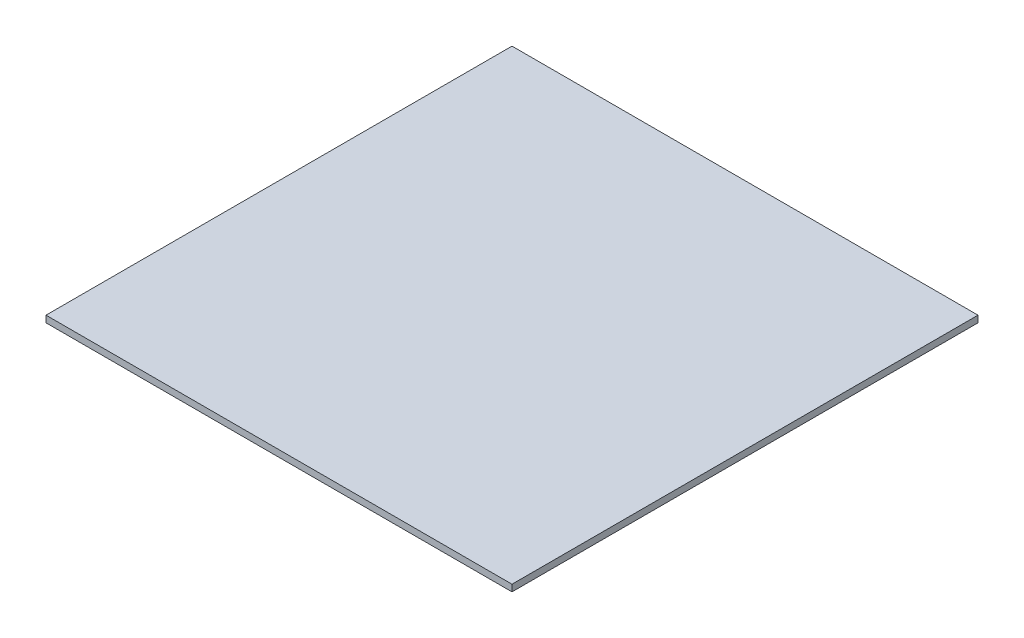
ISO-10303-21;
HEADER;
FILE_DESCRIPTION(('STEP AP214'),'2;1');
FILE_NAME('part.step','',(''),(''),'','','');
FILE_SCHEMA(('AUTOMOTIVE_DESIGN { 1 0 10303 214 1 1 1 1 }'));
ENDSEC;
DATA;
#1=APPLICATION_CONTEXT('core data for automotive mechanical design processes');
#2=APPLICATION_PROTOCOL_DEFINITION('international standard','automotive_design',2000,#1);
#3=PRODUCT_CONTEXT('',#1,'mechanical');
#4=PRODUCT('Part','Part','',(#3));
#5=PRODUCT_RELATED_PRODUCT_CATEGORY('part','',(#4));
#6=PRODUCT_DEFINITION_FORMATION('','',#4);
#7=PRODUCT_DEFINITION_CONTEXT('part definition',#1,'design');
#8=PRODUCT_DEFINITION('design','',#6,#7);
#9=PRODUCT_DEFINITION_SHAPE('','',#8);
#10=(LENGTH_UNIT() NAMED_UNIT(*) SI_UNIT(.MILLI.,.METRE.));
#11=(NAMED_UNIT(*) PLANE_ANGLE_UNIT() SI_UNIT($,.RADIAN.));
#12=(NAMED_UNIT(*) SI_UNIT($,.STERADIAN.) SOLID_ANGLE_UNIT());
#13=UNCERTAINTY_MEASURE_WITH_UNIT(LENGTH_MEASURE(1.E-05),#10,'distance_accuracy_value','');
#14=(GEOMETRIC_REPRESENTATION_CONTEXT(3) GLOBAL_UNCERTAINTY_ASSIGNED_CONTEXT((#13)) GLOBAL_UNIT_ASSIGNED_CONTEXT((#10,
#11,#12)) REPRESENTATION_CONTEXT('',''));
#15=CARTESIAN_POINT('',(0.,0.,0.));
#16=DIRECTION('',(0.,0.,1.));
#17=DIRECTION('',(1.,0.,0.));
#18=AXIS2_PLACEMENT_3D('',#15,#16,#17);
#19=CARTESIAN_POINT('',(17.78,0.254,17.78));
#20=DIRECTION('',(-1.,0.,0.));
#21=DIRECTION('',(0.,0.,1.));
#22=AXIS2_PLACEMENT_3D('',#19,#20,#21);
#23=PLANE('',#22);
#24=DIRECTION('',(0.,0.,-1.));
#25=VECTOR('',#24,1.);
#26=CARTESIAN_POINT('',(17.78,-0.254,17.78));
#27=LINE('',#26,#25);
#28=CARTESIAN_POINT('',(17.78,-0.254,17.78));
#29=VERTEX_POINT('',#28);
#30=CARTESIAN_POINT('',(17.78,-0.254,-17.78));
#31=VERTEX_POINT('',#30);
#32=EDGE_CURVE('E95',#29,#31,#27,.T.);
#33=ORIENTED_EDGE('',*,*,#32,.T.);
#34=DIRECTION('',(0.,-1.,0.));
#35=VECTOR('',#34,1.);
#36=CARTESIAN_POINT('',(17.78,0.254,-17.78));
#37=LINE('',#36,#35);
#38=CARTESIAN_POINT('',(17.78,0.254,-17.78));
#39=VERTEX_POINT('',#38);
#40=EDGE_CURVE('E11',#39,#31,#37,.T.);
#41=ORIENTED_EDGE('',*,*,#40,.F.);
#42=DIRECTION('',(0.,0.,-1.));
#43=VECTOR('',#42,1.);
#44=CARTESIAN_POINT('',(17.78,0.254,17.78));
#45=LINE('',#44,#43);
#46=CARTESIAN_POINT('',(17.78,0.254,17.78));
#47=VERTEX_POINT('',#46);
#48=EDGE_CURVE('E83',#47,#39,#45,.T.);
#49=ORIENTED_EDGE('',*,*,#48,.F.);
#50=DIRECTION('',(0.,-1.,0.));
#51=VECTOR('',#50,1.);
#52=CARTESIAN_POINT('',(17.78,0.254,17.78));
#53=LINE('',#52,#51);
#54=EDGE_CURVE('E91',#47,#29,#53,.T.);
#55=ORIENTED_EDGE('',*,*,#54,.T.);
#56=EDGE_LOOP('',(#33,#41,#49,#55));
#57=FACE_BOUND('',#56,.T.);
#58=ADVANCED_FACE('F32',(#57),#23,.F.);
#59=CARTESIAN_POINT('',(-17.78,0.254,-17.78));
#60=DIRECTION('',(0.,0.,1.));
#61=DIRECTION('',(1.,0.,0.));
#62=AXIS2_PLACEMENT_3D('',#59,#60,#61);
#63=PLANE('',#62);
#64=DIRECTION('',(-1.,0.,0.));
#65=VECTOR('',#64,1.);
#66=CARTESIAN_POINT('',(-17.78,-0.254,-17.78));
#67=LINE('',#66,#65);
#68=CARTESIAN_POINT('',(-17.78,-0.254,-17.78));
#69=VERTEX_POINT('',#68);
#70=EDGE_CURVE('E87',#31,#69,#67,.T.);
#71=ORIENTED_EDGE('',*,*,#70,.T.);
#72=DIRECTION('',(0.,-1.,0.));
#73=VECTOR('',#72,1.);
#74=CARTESIAN_POINT('',(-17.78,0.254,-17.78));
#75=LINE('',#74,#73);
#76=CARTESIAN_POINT('',(-17.78,0.254,-17.78));
#77=VERTEX_POINT('',#76);
#78=EDGE_CURVE('E40',#77,#69,#75,.T.);
#79=ORIENTED_EDGE('',*,*,#78,.F.);
#80=DIRECTION('',(-1.,0.,0.));
#81=VECTOR('',#80,1.);
#82=CARTESIAN_POINT('',(-17.78,0.254,-17.78));
#83=LINE('',#82,#81);
#84=EDGE_CURVE('E78',#39,#77,#83,.T.);
#85=ORIENTED_EDGE('',*,*,#84,.F.);
#86=ORIENTED_EDGE('',*,*,#40,.T.);
#87=EDGE_LOOP('',(#71,#79,#85,#86));
#88=FACE_BOUND('',#87,.T.);
#89=ADVANCED_FACE('F86',(#88),#63,.F.);
#90=CARTESIAN_POINT('',(-17.78,0.254,17.78));
#91=DIRECTION('',(1.,0.,0.));
#92=DIRECTION('',(0.,0.,-1.));
#93=AXIS2_PLACEMENT_3D('',#90,#91,#92);
#94=PLANE('',#93);
#95=DIRECTION('',(0.,0.,1.));
#96=VECTOR('',#95,1.);
#97=CARTESIAN_POINT('',(-17.78,-0.254,17.78));
#98=LINE('',#97,#96);
#99=CARTESIAN_POINT('',(-17.78,-0.254,17.78));
#100=VERTEX_POINT('',#99);
#101=EDGE_CURVE('E65',#69,#100,#98,.T.);
#102=ORIENTED_EDGE('',*,*,#101,.T.);
#103=DIRECTION('',(0.,-1.,0.));
#104=VECTOR('',#103,1.);
#105=CARTESIAN_POINT('',(-17.78,0.254,17.78));
#106=LINE('',#105,#104);
#107=CARTESIAN_POINT('',(-17.78,0.254,17.78));
#108=VERTEX_POINT('',#107);
#109=EDGE_CURVE('E88',#108,#100,#106,.T.);
#110=ORIENTED_EDGE('',*,*,#109,.F.);
#111=DIRECTION('',(0.,0.,1.));
#112=VECTOR('',#111,1.);
#113=CARTESIAN_POINT('',(-17.78,0.254,17.78));
#114=LINE('',#113,#112);
#115=EDGE_CURVE('E81',#77,#108,#114,.T.);
#116=ORIENTED_EDGE('',*,*,#115,.F.);
#117=ORIENTED_EDGE('',*,*,#78,.T.);
#118=EDGE_LOOP('',(#102,#110,#116,#117));
#119=FACE_BOUND('',#118,.T.);
#120=ADVANCED_FACE('F89',(#119),#94,.F.);
#121=CARTESIAN_POINT('',(-17.78,0.254,17.78));
#122=DIRECTION('',(0.,0.,-1.));
#123=DIRECTION('',(-1.,0.,0.));
#124=AXIS2_PLACEMENT_3D('',#121,#122,#123);
#125=PLANE('',#124);
#126=DIRECTION('',(1.,0.,0.));
#127=VECTOR('',#126,1.);
#128=CARTESIAN_POINT('',(-17.78,-0.254,17.78));
#129=LINE('',#128,#127);
#130=EDGE_CURVE('E71',#100,#29,#129,.T.);
#131=ORIENTED_EDGE('',*,*,#130,.T.);
#132=ORIENTED_EDGE('',*,*,#54,.F.);
#133=DIRECTION('',(1.,0.,0.));
#134=VECTOR('',#133,1.);
#135=CARTESIAN_POINT('',(-17.78,0.254,17.78));
#136=LINE('',#135,#134);
#137=EDGE_CURVE('E48',#108,#47,#136,.T.);
#138=ORIENTED_EDGE('',*,*,#137,.F.);
#139=ORIENTED_EDGE('',*,*,#109,.T.);
#140=EDGE_LOOP('',(#131,#132,#138,#139));
#141=FACE_BOUND('',#140,.T.);
#142=ADVANCED_FACE('F102',(#141),#125,.F.);
#143=CARTESIAN_POINT('',(0.,0.254,0.));
#144=DIRECTION('',(0.,-1.,0.));
#145=DIRECTION('',(0.,0.,-1.));
#146=AXIS2_PLACEMENT_3D('',#143,#144,#145);
#147=PLANE('',#146);
#148=ORIENTED_EDGE('',*,*,#48,.T.);
#149=ORIENTED_EDGE('',*,*,#84,.T.);
#150=ORIENTED_EDGE('',*,*,#115,.T.);
#151=ORIENTED_EDGE('',*,*,#137,.T.);
#152=EDGE_LOOP('',(#148,#149,#150,#151));
#153=FACE_BOUND('',#152,.T.);
#154=ADVANCED_FACE('F79',(#153),#147,.F.);
#155=CARTESIAN_POINT('',(0.,-0.254,0.));
#156=DIRECTION('',(0.,-1.,0.));
#157=DIRECTION('',(0.,0.,-1.));
#158=AXIS2_PLACEMENT_3D('',#155,#156,#157);
#159=PLANE('',#158);
#160=ORIENTED_EDGE('',*,*,#32,.F.);
#161=ORIENTED_EDGE('',*,*,#130,.F.);
#162=ORIENTED_EDGE('',*,*,#101,.F.);
#163=ORIENTED_EDGE('',*,*,#70,.F.);
#164=EDGE_LOOP('',(#160,#161,#162,#163));
#165=FACE_BOUND('',#164,.T.);
#166=ADVANCED_FACE('F105',(#165),#159,.T.);
#167=CLOSED_SHELL('',(#58,#89,#120,#142,#154,#166));
#168=MANIFOLD_SOLID_BREP('B2',#167);
#169=ADVANCED_BREP_SHAPE_REPRESENTATION('',(#18,#168),#14);
#170=SHAPE_DEFINITION_REPRESENTATION(#9,#169);
ENDSEC;
END-ISO-10303-21;
